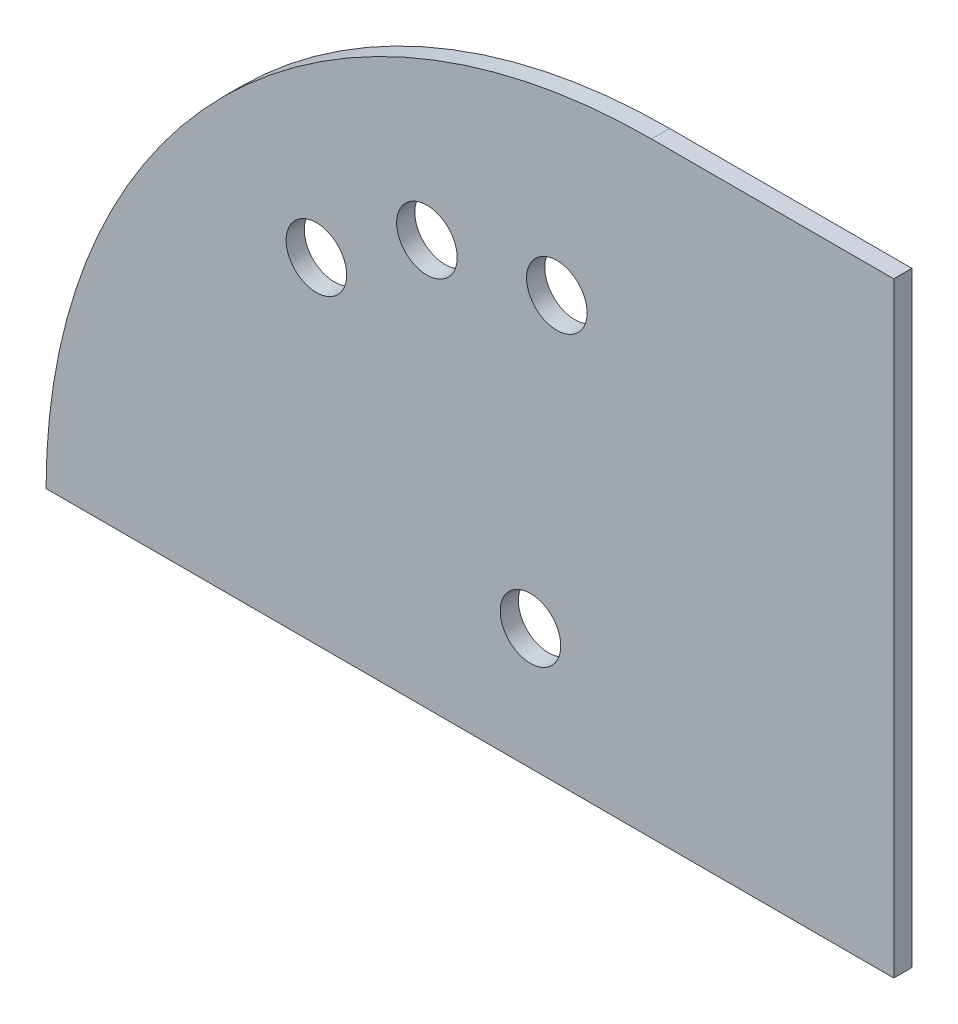
ISO-10303-21;
HEADER;
FILE_DESCRIPTION(('STEP AP214'),'2;1');
FILE_NAME('part.step','',(''),(''),'','','');
FILE_SCHEMA(('AUTOMOTIVE_DESIGN { 1 0 10303 214 1 1 1 1 }'));
ENDSEC;
DATA;
#1=APPLICATION_CONTEXT('core data for automotive mechanical design processes');
#2=APPLICATION_PROTOCOL_DEFINITION('international standard','automotive_design',2000,#1);
#3=PRODUCT_CONTEXT('',#1,'mechanical');
#4=PRODUCT('Part','Part','',(#3));
#5=PRODUCT_RELATED_PRODUCT_CATEGORY('part','',(#4));
#6=PRODUCT_DEFINITION_FORMATION('','',#4);
#7=PRODUCT_DEFINITION_CONTEXT('part definition',#1,'design');
#8=PRODUCT_DEFINITION('design','',#6,#7);
#9=PRODUCT_DEFINITION_SHAPE('','',#8);
#10=(LENGTH_UNIT() NAMED_UNIT(*) SI_UNIT(.MILLI.,.METRE.));
#11=(NAMED_UNIT(*) PLANE_ANGLE_UNIT() SI_UNIT($,.RADIAN.));
#12=(NAMED_UNIT(*) SI_UNIT($,.STERADIAN.) SOLID_ANGLE_UNIT());
#13=UNCERTAINTY_MEASURE_WITH_UNIT(LENGTH_MEASURE(1.E-05),#10,'distance_accuracy_value','');
#14=(GEOMETRIC_REPRESENTATION_CONTEXT(3) GLOBAL_UNCERTAINTY_ASSIGNED_CONTEXT((#13)) GLOBAL_UNIT_ASSIGNED_CONTEXT((#10,
#11,#12)) REPRESENTATION_CONTEXT('',''));
#15=CARTESIAN_POINT('',(0.,0.,0.));
#16=DIRECTION('',(0.,0.,1.));
#17=DIRECTION('',(1.,0.,0.));
#18=AXIS2_PLACEMENT_3D('',#15,#16,#17);
#19=CARTESIAN_POINT('',(0.,0.,-3.));
#20=DIRECTION('',(0.,-1.,0.));
#21=DIRECTION('',(1.,0.,0.));
#22=AXIS2_PLACEMENT_3D('',#19,#20,#21);
#23=PLANE('',#22);
#24=DIRECTION('',(1.,0.,0.));
#25=VECTOR('',#24,1.);
#26=CARTESIAN_POINT('',(0.,0.,0.));
#27=LINE('',#26,#25);
#28=CARTESIAN_POINT('',(-100.,0.,0.));
#29=VERTEX_POINT('',#28);
#30=CARTESIAN_POINT('',(40.,0.,0.));
#31=VERTEX_POINT('',#30);
#32=EDGE_CURVE('E95',#29,#31,#27,.T.);
#33=ORIENTED_EDGE('',*,*,#32,.F.);
#34=DIRECTION('',(0.,0.,1.));
#35=VECTOR('',#34,1.);
#36=CARTESIAN_POINT('',(-100.,0.,-3.));
#37=LINE('',#36,#35);
#38=CARTESIAN_POINT('',(-100.,0.,-3.));
#39=VERTEX_POINT('',#38);
#40=EDGE_CURVE('E11',#39,#29,#37,.T.);
#41=ORIENTED_EDGE('',*,*,#40,.F.);
#42=DIRECTION('',(1.,0.,0.));
#43=VECTOR('',#42,1.);
#44=CARTESIAN_POINT('',(0.,0.,-3.));
#45=LINE('',#44,#43);
#46=CARTESIAN_POINT('',(40.,0.,-3.));
#47=VERTEX_POINT('',#46);
#48=EDGE_CURVE('E54',#39,#47,#45,.T.);
#49=ORIENTED_EDGE('',*,*,#48,.T.);
#50=DIRECTION('',(0.,0.,1.));
#51=VECTOR('',#50,1.);
#52=CARTESIAN_POINT('',(40.,0.,-3.));
#53=LINE('',#52,#51);
#54=EDGE_CURVE('E39',#47,#31,#53,.T.);
#55=ORIENTED_EDGE('',*,*,#54,.T.);
#56=EDGE_LOOP('',(#33,#41,#49,#55));
#57=FACE_BOUND('',#56,.T.);
#58=ADVANCED_FACE('F35',(#57),#23,.T.);
#59=CARTESIAN_POINT('',(0.,0.,-3.));
#60=DIRECTION('',(0.,0.,1.));
#61=DIRECTION('',(1.,0.,0.));
#62=AXIS2_PLACEMENT_3D('',#59,#60,#61);
#63=CYLINDRICAL_SURFACE('',#62,100.);
#64=CARTESIAN_POINT('',(0.,0.,0.));
#65=DIRECTION('',(0.,0.,1.));
#66=DIRECTION('',(-1.,0.,0.));
#67=AXIS2_PLACEMENT_3D('',#64,#65,#66);
#68=CIRCLE('',#67,100.);
#69=CARTESIAN_POINT('',(0.,100.,0.));
#70=VERTEX_POINT('',#69);
#71=EDGE_CURVE('E104',#70,#29,#68,.T.);
#72=ORIENTED_EDGE('',*,*,#71,.F.);
#73=DIRECTION('',(0.,0.,1.));
#74=VECTOR('',#73,1.);
#75=CARTESIAN_POINT('',(0.,100.,-3.));
#76=LINE('',#75,#74);
#77=CARTESIAN_POINT('',(0.,100.,-3.));
#78=VERTEX_POINT('',#77);
#79=EDGE_CURVE('E45',#78,#70,#76,.T.);
#80=ORIENTED_EDGE('',*,*,#79,.F.);
#81=CARTESIAN_POINT('',(0.,0.,-3.));
#82=DIRECTION('',(0.,0.,1.));
#83=DIRECTION('',(-1.,0.,0.));
#84=AXIS2_PLACEMENT_3D('',#81,#82,#83);
#85=CIRCLE('',#84,100.);
#86=EDGE_CURVE('E92',#78,#39,#85,.T.);
#87=ORIENTED_EDGE('',*,*,#86,.T.);
#88=ORIENTED_EDGE('',*,*,#40,.T.);
#89=EDGE_LOOP('',(#72,#80,#87,#88));
#90=FACE_BOUND('',#89,.T.);
#91=ADVANCED_FACE('F111',(#90),#63,.T.);
#92=CARTESIAN_POINT('',(0.,100.,-3.));
#93=DIRECTION('',(0.,1.,0.));
#94=DIRECTION('',(0.,0.,1.));
#95=AXIS2_PLACEMENT_3D('',#92,#93,#94);
#96=PLANE('',#95);
#97=DIRECTION('',(-1.,0.,0.));
#98=VECTOR('',#97,1.);
#99=CARTESIAN_POINT('',(0.,100.,0.));
#100=LINE('',#99,#98);
#101=CARTESIAN_POINT('',(40.,100.,0.));
#102=VERTEX_POINT('',#101);
#103=EDGE_CURVE('E88',#102,#70,#100,.T.);
#104=ORIENTED_EDGE('',*,*,#103,.F.);
#105=DIRECTION('',(0.,0.,1.));
#106=VECTOR('',#105,1.);
#107=CARTESIAN_POINT('',(40.,100.,-3.));
#108=LINE('',#107,#106);
#109=CARTESIAN_POINT('',(40.,100.,-3.));
#110=VERTEX_POINT('',#109);
#111=EDGE_CURVE('E83',#110,#102,#108,.T.);
#112=ORIENTED_EDGE('',*,*,#111,.F.);
#113=DIRECTION('',(-1.,0.,0.));
#114=VECTOR('',#113,1.);
#115=CARTESIAN_POINT('',(0.,100.,-3.));
#116=LINE('',#115,#114);
#117=EDGE_CURVE('E86',#110,#78,#116,.T.);
#118=ORIENTED_EDGE('',*,*,#117,.T.);
#119=ORIENTED_EDGE('',*,*,#79,.T.);
#120=EDGE_LOOP('',(#104,#112,#118,#119));
#121=FACE_BOUND('',#120,.T.);
#122=ADVANCED_FACE('F85',(#121),#96,.T.);
#123=CARTESIAN_POINT('',(40.,0.,-3.));
#124=DIRECTION('',(1.,0.,0.));
#125=DIRECTION('',(0.,0.,-1.));
#126=AXIS2_PLACEMENT_3D('',#123,#124,#125);
#127=PLANE('',#126);
#128=DIRECTION('',(0.,1.,0.));
#129=VECTOR('',#128,1.);
#130=CARTESIAN_POINT('',(40.,0.,0.));
#131=LINE('',#130,#129);
#132=EDGE_CURVE('E100',#31,#102,#131,.T.);
#133=ORIENTED_EDGE('',*,*,#132,.F.);
#134=ORIENTED_EDGE('',*,*,#54,.F.);
#135=DIRECTION('',(0.,1.,0.));
#136=VECTOR('',#135,1.);
#137=CARTESIAN_POINT('',(40.,0.,-3.));
#138=LINE('',#137,#136);
#139=EDGE_CURVE('E91',#47,#110,#138,.T.);
#140=ORIENTED_EDGE('',*,*,#139,.T.);
#141=ORIENTED_EDGE('',*,*,#111,.T.);
#142=EDGE_LOOP('',(#133,#134,#140,#141));
#143=FACE_BOUND('',#142,.T.);
#144=ADVANCED_FACE('F37',(#143),#127,.T.);
#145=CARTESIAN_POINT('',(0.,0.,-3.));
#146=DIRECTION('',(0.,0.,-1.));
#147=DIRECTION('',(-1.,0.,0.));
#148=AXIS2_PLACEMENT_3D('',#145,#146,#147);
#149=PLANE('',#148);
#150=CARTESIAN_POINT('',(-15.6422128626184,69.8097349045912,-3.));
#151=DIRECTION('',(0.,0.,1.));
#152=DIRECTION('',(1.,0.,0.));
#153=AXIS2_PLACEMENT_3D('',#150,#151,#152);
#154=CIRCLE('',#153,5.);
#155=CARTESIAN_POINT('',(-10.6422128626184,69.8097349045912,-3.));
#156=VERTEX_POINT('',#155);
#157=EDGE_CURVE('E146',#156,#156,#154,.T.);
#158=ORIENTED_EDGE('',*,*,#157,.T.);
#159=EDGE_LOOP('',(#158));
#160=FACE_BOUND('',#159,.T.);
#161=CARTESIAN_POINT('',(-37.1010071662845,66.9846310392972,-3.));
#162=DIRECTION('',(0.,0.,1.));
#163=DIRECTION('',(1.,0.,0.));
#164=AXIS2_PLACEMENT_3D('',#161,#162,#163);
#165=CIRCLE('',#164,4.99999999999999);
#166=CARTESIAN_POINT('',(-32.1010071662846,66.9846310392972,-3.));
#167=VERTEX_POINT('',#166);
#168=EDGE_CURVE('E154',#167,#167,#165,.T.);
#169=ORIENTED_EDGE('',*,*,#168,.T.);
#170=EDGE_LOOP('',(#169));
#171=FACE_BOUND('',#170,.T.);
#172=CARTESIAN_POINT('',(-55.3553390593274,55.3553390593273,-3.));
#173=DIRECTION('',(0.,0.,1.));
#174=DIRECTION('',(1.,0.,0.));
#175=AXIS2_PLACEMENT_3D('',#172,#173,#174);
#176=CIRCLE('',#175,5.);
#177=CARTESIAN_POINT('',(-50.3553390593274,55.3553390593273,-3.));
#178=VERTEX_POINT('',#177);
#179=EDGE_CURVE('E160',#178,#178,#176,.T.);
#180=ORIENTED_EDGE('',*,*,#179,.T.);
#181=EDGE_LOOP('',(#180));
#182=FACE_BOUND('',#181,.T.);
#183=CARTESIAN_POINT('',(-20.,20.,-3.));
#184=DIRECTION('',(0.,0.,1.));
#185=DIRECTION('',(1.,0.,0.));
#186=AXIS2_PLACEMENT_3D('',#183,#184,#185);
#187=CIRCLE('',#186,5.);
#188=CARTESIAN_POINT('',(-15.,20.,-3.));
#189=VERTEX_POINT('',#188);
#190=EDGE_CURVE('E102',#189,#189,#187,.T.);
#191=ORIENTED_EDGE('',*,*,#190,.T.);
#192=EDGE_LOOP('',(#191));
#193=FACE_BOUND('',#192,.T.);
#194=ORIENTED_EDGE('',*,*,#48,.F.);
#195=ORIENTED_EDGE('',*,*,#86,.F.);
#196=ORIENTED_EDGE('',*,*,#117,.F.);
#197=ORIENTED_EDGE('',*,*,#139,.F.);
#198=EDGE_LOOP('',(#194,#195,#196,#197));
#199=FACE_BOUND('',#198,.T.);
#200=ADVANCED_FACE('F90',(#160,#171,#182,#193,#199),#149,.T.);
#201=CARTESIAN_POINT('',(0.,0.,0.));
#202=DIRECTION('',(0.,0.,-1.));
#203=DIRECTION('',(-1.,0.,0.));
#204=AXIS2_PLACEMENT_3D('',#201,#202,#203);
#205=PLANE('',#204);
#206=CARTESIAN_POINT('',(-15.6422128626184,69.8097349045912,0.));
#207=DIRECTION('',(0.,0.,1.));
#208=DIRECTION('',(1.,0.,0.));
#209=AXIS2_PLACEMENT_3D('',#206,#207,#208);
#210=CIRCLE('',#209,5.);
#211=CARTESIAN_POINT('',(-10.6422128626184,69.8097349045912,0.));
#212=VERTEX_POINT('',#211);
#213=EDGE_CURVE('E149',#212,#212,#210,.T.);
#214=ORIENTED_EDGE('',*,*,#213,.F.);
#215=EDGE_LOOP('',(#214));
#216=FACE_BOUND('',#215,.T.);
#217=CARTESIAN_POINT('',(-37.1010071662845,66.9846310392972,0.));
#218=DIRECTION('',(0.,0.,1.));
#219=DIRECTION('',(1.,0.,0.));
#220=AXIS2_PLACEMENT_3D('',#217,#218,#219);
#221=CIRCLE('',#220,4.99999999999999);
#222=CARTESIAN_POINT('',(-32.1010071662846,66.9846310392972,0.));
#223=VERTEX_POINT('',#222);
#224=EDGE_CURVE('E151',#223,#223,#221,.T.);
#225=ORIENTED_EDGE('',*,*,#224,.F.);
#226=EDGE_LOOP('',(#225));
#227=FACE_BOUND('',#226,.T.);
#228=CARTESIAN_POINT('',(-55.3553390593274,55.3553390593273,0.));
#229=DIRECTION('',(0.,0.,1.));
#230=DIRECTION('',(1.,0.,0.));
#231=AXIS2_PLACEMENT_3D('',#228,#229,#230);
#232=CIRCLE('',#231,5.);
#233=CARTESIAN_POINT('',(-50.3553390593274,55.3553390593273,0.));
#234=VERTEX_POINT('',#233);
#235=EDGE_CURVE('E157',#234,#234,#232,.T.);
#236=ORIENTED_EDGE('',*,*,#235,.F.);
#237=EDGE_LOOP('',(#236));
#238=FACE_BOUND('',#237,.T.);
#239=CARTESIAN_POINT('',(-20.,20.,0.));
#240=DIRECTION('',(0.,0.,1.));
#241=DIRECTION('',(1.,0.,0.));
#242=AXIS2_PLACEMENT_3D('',#239,#240,#241);
#243=CIRCLE('',#242,5.);
#244=CARTESIAN_POINT('',(-15.,20.,0.));
#245=VERTEX_POINT('',#244);
#246=EDGE_CURVE('E163',#245,#245,#243,.T.);
#247=ORIENTED_EDGE('',*,*,#246,.F.);
#248=EDGE_LOOP('',(#247));
#249=FACE_BOUND('',#248,.T.);
#250=ORIENTED_EDGE('',*,*,#32,.T.);
#251=ORIENTED_EDGE('',*,*,#132,.T.);
#252=ORIENTED_EDGE('',*,*,#103,.T.);
#253=ORIENTED_EDGE('',*,*,#71,.T.);
#254=EDGE_LOOP('',(#250,#251,#252,#253));
#255=FACE_BOUND('',#254,.T.);
#256=ADVANCED_FACE('F109',(#216,#227,#238,#249,#255),#205,.F.);
#257=CARTESIAN_POINT('',(-20.,20.,-3.));
#258=DIRECTION('',(0.,0.,1.));
#259=DIRECTION('',(1.,0.,0.));
#260=AXIS2_PLACEMENT_3D('',#257,#258,#259);
#261=CYLINDRICAL_SURFACE('',#260,5.);
#262=ORIENTED_EDGE('',*,*,#190,.F.);
#263=EDGE_LOOP('',(#262));
#264=FACE_BOUND('',#263,.T.);
#265=ORIENTED_EDGE('',*,*,#246,.T.);
#266=EDGE_LOOP('',(#265));
#267=FACE_BOUND('',#266,.T.);
#268=ADVANCED_FACE('F122',(#264,#267),#261,.F.);
#269=CARTESIAN_POINT('',(-55.3553390593274,55.3553390593273,-3.));
#270=DIRECTION('',(0.,0.,1.));
#271=DIRECTION('',(1.,0.,0.));
#272=AXIS2_PLACEMENT_3D('',#269,#270,#271);
#273=CYLINDRICAL_SURFACE('',#272,5.);
#274=ORIENTED_EDGE('',*,*,#179,.F.);
#275=EDGE_LOOP('',(#274));
#276=FACE_BOUND('',#275,.T.);
#277=ORIENTED_EDGE('',*,*,#235,.T.);
#278=EDGE_LOOP('',(#277));
#279=FACE_BOUND('',#278,.T.);
#280=ADVANCED_FACE('F129',(#276,#279),#273,.F.);
#281=CARTESIAN_POINT('',(-37.1010071662845,66.9846310392972,-3.));
#282=DIRECTION('',(0.,0.,1.));
#283=DIRECTION('',(1.,0.,0.));
#284=AXIS2_PLACEMENT_3D('',#281,#282,#283);
#285=CYLINDRICAL_SURFACE('',#284,4.99999999999999);
#286=ORIENTED_EDGE('',*,*,#168,.F.);
#287=EDGE_LOOP('',(#286));
#288=FACE_BOUND('',#287,.T.);
#289=ORIENTED_EDGE('',*,*,#224,.T.);
#290=EDGE_LOOP('',(#289));
#291=FACE_BOUND('',#290,.T.);
#292=ADVANCED_FACE('F133',(#288,#291),#285,.F.);
#293=CARTESIAN_POINT('',(-15.6422128626184,69.8097349045912,-3.));
#294=DIRECTION('',(0.,0.,1.));
#295=DIRECTION('',(1.,0.,0.));
#296=AXIS2_PLACEMENT_3D('',#293,#294,#295);
#297=CYLINDRICAL_SURFACE('',#296,5.);
#298=ORIENTED_EDGE('',*,*,#157,.F.);
#299=EDGE_LOOP('',(#298));
#300=FACE_BOUND('',#299,.T.);
#301=ORIENTED_EDGE('',*,*,#213,.T.);
#302=EDGE_LOOP('',(#301));
#303=FACE_BOUND('',#302,.T.);
#304=ADVANCED_FACE('F137',(#300,#303),#297,.F.);
#305=CLOSED_SHELL('',(#58,#91,#122,#144,#200,#256,#268,#280,#292,#304));
#306=MANIFOLD_SOLID_BREP('B2',#305);
#307=ADVANCED_BREP_SHAPE_REPRESENTATION('',(#18,#306),#14);
#308=SHAPE_DEFINITION_REPRESENTATION(#9,#307);
ENDSEC;
END-ISO-10303-21;
